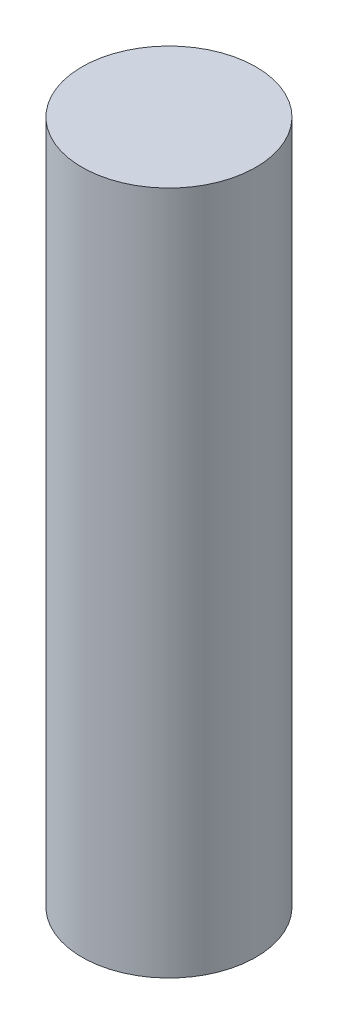
ISO-10303-21;
HEADER;
FILE_DESCRIPTION(('STEP AP214'),'2;1');
FILE_NAME('part.step','',(''),(''),'','','');
FILE_SCHEMA(('AUTOMOTIVE_DESIGN { 1 0 10303 214 1 1 1 1 }'));
ENDSEC;
DATA;
#1=APPLICATION_CONTEXT('core data for automotive mechanical design processes');
#2=APPLICATION_PROTOCOL_DEFINITION('international standard','automotive_design',2000,#1);
#3=PRODUCT_CONTEXT('',#1,'mechanical');
#4=PRODUCT('Part','Part','',(#3));
#5=PRODUCT_RELATED_PRODUCT_CATEGORY('part','',(#4));
#6=PRODUCT_DEFINITION_FORMATION('','',#4);
#7=PRODUCT_DEFINITION_CONTEXT('part definition',#1,'design');
#8=PRODUCT_DEFINITION('design','',#6,#7);
#9=PRODUCT_DEFINITION_SHAPE('','',#8);
#10=(LENGTH_UNIT() NAMED_UNIT(*) SI_UNIT(.MILLI.,.METRE.));
#11=(NAMED_UNIT(*) PLANE_ANGLE_UNIT() SI_UNIT($,.RADIAN.));
#12=(NAMED_UNIT(*) SI_UNIT($,.STERADIAN.) SOLID_ANGLE_UNIT());
#13=UNCERTAINTY_MEASURE_WITH_UNIT(LENGTH_MEASURE(1.E-05),#10,'distance_accuracy_value','');
#14=(GEOMETRIC_REPRESENTATION_CONTEXT(3) GLOBAL_UNCERTAINTY_ASSIGNED_CONTEXT((#13)) GLOBAL_UNIT_ASSIGNED_CONTEXT((#10,
#11,#12)) REPRESENTATION_CONTEXT('',''));
#15=CARTESIAN_POINT('',(0.,0.,0.));
#16=DIRECTION('',(0.,0.,1.));
#17=DIRECTION('',(1.,0.,0.));
#18=AXIS2_PLACEMENT_3D('',#15,#16,#17);
#19=CARTESIAN_POINT('',(0.,57.,0.));
#20=DIRECTION('',(0.,-1.,0.));
#21=DIRECTION('',(0.,0.,-1.));
#22=AXIS2_PLACEMENT_3D('',#19,#20,#21);
#23=CYLINDRICAL_SURFACE('',#22,14.5);
#24=CARTESIAN_POINT('',(0.,57.,0.));
#25=DIRECTION('',(0.,1.,0.));
#26=DIRECTION('',(0.,0.,1.));
#27=AXIS2_PLACEMENT_3D('',#24,#25,#26);
#28=CIRCLE('',#27,14.5);
#29=CARTESIAN_POINT('',(0.,57.,-14.5));
#30=VERTEX_POINT('',#29);
#31=EDGE_CURVE('E10',#30,#30,#28,.T.);
#32=CARTESIAN_POINT('',(0.,-57.,0.));
#33=DIRECTION('',(0.,1.,0.));
#34=DIRECTION('',(0.,0.,1.));
#35=AXIS2_PLACEMENT_3D('',#32,#33,#34);
#36=CIRCLE('',#35,14.5);
#37=CARTESIAN_POINT('',(0.,-57.,-14.5));
#38=VERTEX_POINT('',#37);
#39=EDGE_CURVE('E44',#38,#38,#36,.T.);
#40=CARTESIAN_POINT('',(0.,57.,-14.5));
#41=CARTESIAN_POINT('',(0.,55.8125,-14.5));
#42=CARTESIAN_POINT('',(0.,54.625,-14.5));
#43=CARTESIAN_POINT('',(0.,52.25,-14.5));
#44=CARTESIAN_POINT('',(0.,51.0625,-14.5));
#45=CARTESIAN_POINT('',(0.,48.6875,-14.5));
#46=CARTESIAN_POINT('',(0.,47.5,-14.5));
#47=CARTESIAN_POINT('',(0.,45.125,-14.5));
#48=CARTESIAN_POINT('',(0.,43.9375,-14.5));
#49=CARTESIAN_POINT('',(0.,41.5625,-14.5));
#50=CARTESIAN_POINT('',(0.,40.375,-14.5));
#51=CARTESIAN_POINT('',(0.,38.,-14.5));
#52=CARTESIAN_POINT('',(0.,36.8125,-14.5));
#53=CARTESIAN_POINT('',(0.,34.4375,-14.5));
#54=CARTESIAN_POINT('',(0.,33.25,-14.5));
#55=CARTESIAN_POINT('',(0.,30.875,-14.5));
#56=CARTESIAN_POINT('',(0.,29.6875,-14.5));
#57=CARTESIAN_POINT('',(0.,27.3125,-14.5));
#58=CARTESIAN_POINT('',(0.,26.125,-14.5));
#59=CARTESIAN_POINT('',(0.,23.75,-14.5));
#60=CARTESIAN_POINT('',(0.,22.5625,-14.5));
#61=CARTESIAN_POINT('',(0.,20.1875,-14.5));
#62=CARTESIAN_POINT('',(0.,19.,-14.5));
#63=CARTESIAN_POINT('',(0.,16.625,-14.5));
#64=CARTESIAN_POINT('',(0.,15.4375,-14.5));
#65=CARTESIAN_POINT('',(0.,13.0625,-14.5));
#66=CARTESIAN_POINT('',(0.,11.875,-14.5));
#67=CARTESIAN_POINT('',(0.,9.49999999999999,-14.5));
#68=CARTESIAN_POINT('',(0.,8.31249999999999,-14.5));
#69=CARTESIAN_POINT('',(0.,5.93749999999999,-14.5));
#70=CARTESIAN_POINT('',(0.,4.74999999999999,-14.5));
#71=CARTESIAN_POINT('',(0.,2.375,-14.5));
#72=CARTESIAN_POINT('',(0.,1.18749999999999,-14.5));
#73=CARTESIAN_POINT('',(0.,-1.18750000000001,-14.5));
#74=CARTESIAN_POINT('',(0.,-2.37500000000001,-14.5));
#75=CARTESIAN_POINT('',(0.,-4.75000000000001,-14.5));
#76=CARTESIAN_POINT('',(0.,-5.9375,-14.5));
#77=CARTESIAN_POINT('',(0.,-8.3125,-14.5));
#78=CARTESIAN_POINT('',(0.,-9.5,-14.5));
#79=CARTESIAN_POINT('',(0.,-11.875,-14.5));
#80=CARTESIAN_POINT('',(0.,-13.0625,-14.5));
#81=CARTESIAN_POINT('',(0.,-15.4375,-14.5));
#82=CARTESIAN_POINT('',(0.,-16.625,-14.5));
#83=CARTESIAN_POINT('',(0.,-19.,-14.5));
#84=CARTESIAN_POINT('',(0.,-20.1875,-14.5));
#85=CARTESIAN_POINT('',(0.,-22.5625,-14.5));
#86=CARTESIAN_POINT('',(0.,-23.75,-14.5));
#87=CARTESIAN_POINT('',(0.,-26.125,-14.5));
#88=CARTESIAN_POINT('',(0.,-27.3125,-14.5));
#89=CARTESIAN_POINT('',(0.,-29.6875,-14.5));
#90=CARTESIAN_POINT('',(0.,-30.875,-14.5));
#91=CARTESIAN_POINT('',(0.,-33.25,-14.5));
#92=CARTESIAN_POINT('',(0.,-34.4375,-14.5));
#93=CARTESIAN_POINT('',(0.,-36.8125,-14.5));
#94=CARTESIAN_POINT('',(0.,-38.,-14.5));
#95=CARTESIAN_POINT('',(0.,-40.375,-14.5));
#96=CARTESIAN_POINT('',(0.,-41.5625,-14.5));
#97=CARTESIAN_POINT('',(0.,-43.9375,-14.5));
#98=CARTESIAN_POINT('',(0.,-45.125,-14.5));
#99=CARTESIAN_POINT('',(0.,-47.5,-14.5));
#100=CARTESIAN_POINT('',(0.,-48.6875,-14.5));
#101=CARTESIAN_POINT('',(0.,-51.0625,-14.5));
#102=CARTESIAN_POINT('',(0.,-52.25,-14.5));
#103=CARTESIAN_POINT('',(0.,-54.625,-14.5));
#104=CARTESIAN_POINT('',(0.,-55.8125,-14.5));
#105=CARTESIAN_POINT('',(0.,-57.,-14.5));
#106=B_SPLINE_CURVE_WITH_KNOTS('',3,(#40,#41,#42,#43,#44,#45,#46,#47,#48,#49,#50,#51,#52,#53,
#54,#55,#56,#57,#58,#59,#60,#61,#62,#63,#64,#65,#66,#67,#68,#69,#70,#71,#72,#73,#74,#75,#76,#77,
#78,#79,#80,#81,#82,#83,#84,#85,#86,#87,#88,#89,#90,#91,#92,#93,#94,#95,#96,#97,#98,#99,#100,
#101,#102,#103,#104,#105),.UNSPECIFIED.,.F.,.F.,(4,2,2,2,2,2,2,2,2,2,2,2,2,2,2,2,2,2,2,2,2,2,2,
2,2,2,2,2,2,2,2,2,4),(0.,3.5625,7.125,10.6875,14.25,17.8125,21.375,24.9375,28.5,32.0625,35.625,
39.1875,42.75,46.3125,49.875,53.4375,57.,60.5625,64.125,67.6875,71.25,74.8125,78.375,81.9375,
85.5,89.0625,92.625,96.1875,99.75,103.3125,106.875,110.4375,114.),.UNSPECIFIED.);
#107=EDGE_CURVE('BSEAM45',#30,#38,#106,.T.);
#108=ORIENTED_EDGE('',*,*,#31,.F.);
#109=ORIENTED_EDGE('',*,*,#39,.T.);
#110=ORIENTED_EDGE('',*,*,#107,.T.);
#111=ORIENTED_EDGE('',*,*,#107,.F.);
#112=EDGE_LOOP('',(#108,#110,#109,#111));
#113=FACE_BOUND('',#112,.T.);
#114=ADVANCED_FACE('F45',(#113),#23,.T.);
#115=CARTESIAN_POINT('',(0.,57.,0.));
#116=DIRECTION('',(0.,1.,0.));
#117=DIRECTION('',(0.,0.,1.));
#118=AXIS2_PLACEMENT_3D('',#115,#116,#117);
#119=PLANE('',#118);
#120=ORIENTED_EDGE('',*,*,#31,.T.);
#121=EDGE_LOOP('',(#120));
#122=FACE_BOUND('',#121,.T.);
#123=ADVANCED_FACE('F60',(#122),#119,.T.);
#124=CARTESIAN_POINT('',(0.,-57.,0.));
#125=DIRECTION('',(0.,1.,0.));
#126=DIRECTION('',(0.,0.,1.));
#127=AXIS2_PLACEMENT_3D('',#124,#125,#126);
#128=PLANE('',#127);
#129=ORIENTED_EDGE('',*,*,#39,.F.);
#130=EDGE_LOOP('',(#129));
#131=FACE_BOUND('',#130,.T.);
#132=ADVANCED_FACE('F54',(#131),#128,.F.);
#133=CLOSED_SHELL('',(#114,#123,#132));
#134=MANIFOLD_SOLID_BREP('B2',#133);
#135=ADVANCED_BREP_SHAPE_REPRESENTATION('',(#18,#134),#14);
#136=SHAPE_DEFINITION_REPRESENTATION(#9,#135);
ENDSEC;
END-ISO-10303-21;
